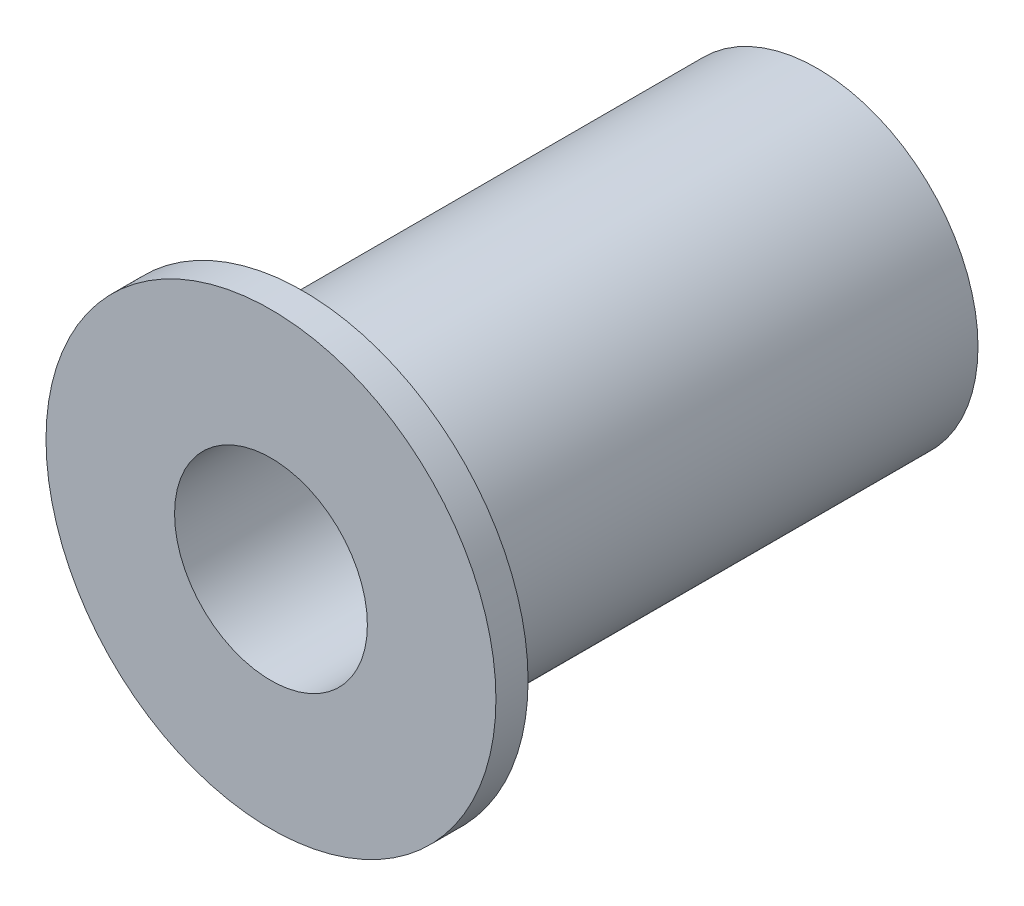
ISO-10303-21;
HEADER;
FILE_DESCRIPTION(('STEP AP214'),'2;1');
FILE_NAME('part.step','',(''),(''),'','','');
FILE_SCHEMA(('AUTOMOTIVE_DESIGN { 1 0 10303 214 1 1 1 1 }'));
ENDSEC;
DATA;
#1=APPLICATION_CONTEXT('core data for automotive mechanical design processes');
#2=APPLICATION_PROTOCOL_DEFINITION('international standard','automotive_design',2000,#1);
#3=PRODUCT_CONTEXT('',#1,'mechanical');
#4=PRODUCT('Part','Part','',(#3));
#5=PRODUCT_RELATED_PRODUCT_CATEGORY('part','',(#4));
#6=PRODUCT_DEFINITION_FORMATION('','',#4);
#7=PRODUCT_DEFINITION_CONTEXT('part definition',#1,'design');
#8=PRODUCT_DEFINITION('design','',#6,#7);
#9=PRODUCT_DEFINITION_SHAPE('','',#8);
#10=(LENGTH_UNIT() NAMED_UNIT(*) SI_UNIT(.MILLI.,.METRE.));
#11=(NAMED_UNIT(*) PLANE_ANGLE_UNIT() SI_UNIT($,.RADIAN.));
#12=(NAMED_UNIT(*) SI_UNIT($,.STERADIAN.) SOLID_ANGLE_UNIT());
#13=UNCERTAINTY_MEASURE_WITH_UNIT(LENGTH_MEASURE(1.E-05),#10,'distance_accuracy_value','');
#14=(GEOMETRIC_REPRESENTATION_CONTEXT(3) GLOBAL_UNCERTAINTY_ASSIGNED_CONTEXT((#13)) GLOBAL_UNIT_ASSIGNED_CONTEXT((#10,
#11,#12)) REPRESENTATION_CONTEXT('',''));
#15=CARTESIAN_POINT('',(0.,0.,0.));
#16=DIRECTION('',(0.,0.,1.));
#17=DIRECTION('',(1.,0.,0.));
#18=AXIS2_PLACEMENT_3D('',#15,#16,#17);
#19=CARTESIAN_POINT('',(0.,0.,-12.7));
#20=DIRECTION('',(0.,0.,1.));
#21=DIRECTION('',(1.,0.,0.));
#22=AXIS2_PLACEMENT_3D('',#19,#20,#21);
#23=PLANE('',#22);
#24=CARTESIAN_POINT('',(0.,0.,-12.7));
#25=DIRECTION('',(0.,0.,1.));
#26=DIRECTION('',(1.,0.,0.));
#27=AXIS2_PLACEMENT_3D('',#24,#25,#26);
#28=CIRCLE('',#27,7.9375);
#29=CARTESIAN_POINT('',(7.9375,0.,-12.7));
#30=VERTEX_POINT('',#29);
#31=EDGE_CURVE('E35',#30,#30,#28,.T.);
#32=ORIENTED_EDGE('',*,*,#31,.F.);
#33=EDGE_LOOP('',(#32));
#34=FACE_BOUND('',#33,.T.);
#35=CARTESIAN_POINT('',(0.,0.,-12.7));
#36=DIRECTION('',(0.,0.,1.));
#37=DIRECTION('',(1.,0.,0.));
#38=AXIS2_PLACEMENT_3D('',#35,#36,#37);
#39=CIRCLE('',#38,4.7625);
#40=CARTESIAN_POINT('',(4.7625,0.,-12.7));
#41=VERTEX_POINT('',#40);
#42=EDGE_CURVE('E42',#41,#41,#39,.T.);
#43=ORIENTED_EDGE('',*,*,#42,.T.);
#44=EDGE_LOOP('',(#43));
#45=FACE_BOUND('',#44,.T.);
#46=ADVANCED_FACE('F31',(#34,#45),#23,.F.);
#47=CARTESIAN_POINT('',(0.,0.,12.7));
#48=DIRECTION('',(0.,0.,-1.));
#49=DIRECTION('',(-1.,0.,0.));
#50=AXIS2_PLACEMENT_3D('',#47,#48,#49);
#51=CYLINDRICAL_SURFACE('',#50,7.9375);
#52=CARTESIAN_POINT('',(0.,0.,12.7));
#53=DIRECTION('',(0.,0.,1.));
#54=DIRECTION('',(1.,0.,0.));
#55=AXIS2_PLACEMENT_3D('',#52,#53,#54);
#56=CIRCLE('',#55,7.9375);
#57=CARTESIAN_POINT('',(7.9375,0.,12.7));
#58=VERTEX_POINT('',#57);
#59=EDGE_CURVE('E10',#58,#58,#56,.T.);
#60=ORIENTED_EDGE('',*,*,#59,.F.);
#61=EDGE_LOOP('',(#60));
#62=FACE_BOUND('',#61,.T.);
#63=ORIENTED_EDGE('',*,*,#31,.T.);
#64=EDGE_LOOP('',(#63));
#65=FACE_BOUND('',#64,.T.);
#66=ADVANCED_FACE('F33',(#62,#65),#51,.T.);
#67=CARTESIAN_POINT('',(0.,0.,12.7));
#68=DIRECTION('',(0.,0.,-1.));
#69=DIRECTION('',(-1.,0.,0.));
#70=AXIS2_PLACEMENT_3D('',#67,#68,#69);
#71=CYLINDRICAL_SURFACE('',#70,4.7625);
#72=ORIENTED_EDGE('',*,*,#42,.F.);
#73=EDGE_LOOP('',(#72));
#74=FACE_BOUND('',#73,.T.);
#75=CARTESIAN_POINT('',(0.,0.,14.2875));
#76=DIRECTION('',(0.,0.,1.));
#77=DIRECTION('',(1.,0.,0.));
#78=AXIS2_PLACEMENT_3D('',#75,#76,#77);
#79=CIRCLE('',#78,4.7625);
#80=CARTESIAN_POINT('',(4.7625,0.,14.2875));
#81=VERTEX_POINT('',#80);
#82=EDGE_CURVE('E50',#81,#81,#79,.T.);
#83=ORIENTED_EDGE('',*,*,#82,.T.);
#84=EDGE_LOOP('',(#83));
#85=FACE_BOUND('',#84,.T.);
#86=ADVANCED_FACE('F56',(#74,#85),#71,.F.);
#87=CARTESIAN_POINT('',(0.,0.,12.7));
#88=DIRECTION('',(0.,0.,1.));
#89=DIRECTION('',(1.,0.,0.));
#90=AXIS2_PLACEMENT_3D('',#87,#88,#89);
#91=PLANE('',#90);
#92=CARTESIAN_POINT('',(0.,0.,12.7));
#93=DIRECTION('',(0.,0.,1.));
#94=DIRECTION('',(1.,0.,0.));
#95=AXIS2_PLACEMENT_3D('',#92,#93,#94);
#96=CIRCLE('',#95,11.1125);
#97=CARTESIAN_POINT('',(11.1125,0.,12.7));
#98=VERTEX_POINT('',#97);
#99=EDGE_CURVE('E47',#98,#98,#96,.T.);
#100=ORIENTED_EDGE('',*,*,#99,.F.);
#101=EDGE_LOOP('',(#100));
#102=FACE_BOUND('',#101,.T.);
#103=ORIENTED_EDGE('',*,*,#59,.T.);
#104=EDGE_LOOP('',(#103));
#105=FACE_BOUND('',#104,.T.);
#106=ADVANCED_FACE('F61',(#102,#105),#91,.F.);
#107=CARTESIAN_POINT('',(0.,0.,14.2875));
#108=DIRECTION('',(0.,0.,1.));
#109=DIRECTION('',(1.,0.,0.));
#110=AXIS2_PLACEMENT_3D('',#107,#108,#109);
#111=PLANE('',#110);
#112=CARTESIAN_POINT('',(0.,0.,14.2875));
#113=DIRECTION('',(0.,0.,1.));
#114=DIRECTION('',(1.,0.,0.));
#115=AXIS2_PLACEMENT_3D('',#112,#113,#114);
#116=CIRCLE('',#115,11.1125);
#117=CARTESIAN_POINT('',(11.1125,0.,14.2875));
#118=VERTEX_POINT('',#117);
#119=EDGE_CURVE('E46',#118,#118,#116,.T.);
#120=ORIENTED_EDGE('',*,*,#119,.T.);
#121=EDGE_LOOP('',(#120));
#122=FACE_BOUND('',#121,.T.);
#123=ORIENTED_EDGE('',*,*,#82,.F.);
#124=EDGE_LOOP('',(#123));
#125=FACE_BOUND('',#124,.T.);
#126=ADVANCED_FACE('F58',(#122,#125),#111,.T.);
#127=CARTESIAN_POINT('',(0.,0.,14.2875));
#128=DIRECTION('',(0.,0.,-1.));
#129=DIRECTION('',(-1.,0.,0.));
#130=AXIS2_PLACEMENT_3D('',#127,#128,#129);
#131=CYLINDRICAL_SURFACE('',#130,11.1125);
#132=ORIENTED_EDGE('',*,*,#119,.F.);
#133=EDGE_LOOP('',(#132));
#134=FACE_BOUND('',#133,.T.);
#135=ORIENTED_EDGE('',*,*,#99,.T.);
#136=EDGE_LOOP('',(#135));
#137=FACE_BOUND('',#136,.T.);
#138=ADVANCED_FACE('F60',(#134,#137),#131,.T.);
#139=CLOSED_SHELL('',(#46,#66,#86,#106,#126,#138));
#140=MANIFOLD_SOLID_BREP('B2',#139);
#141=ADVANCED_BREP_SHAPE_REPRESENTATION('',(#18,#140),#14);
#142=SHAPE_DEFINITION_REPRESENTATION(#9,#141);
ENDSEC;
END-ISO-10303-21;
